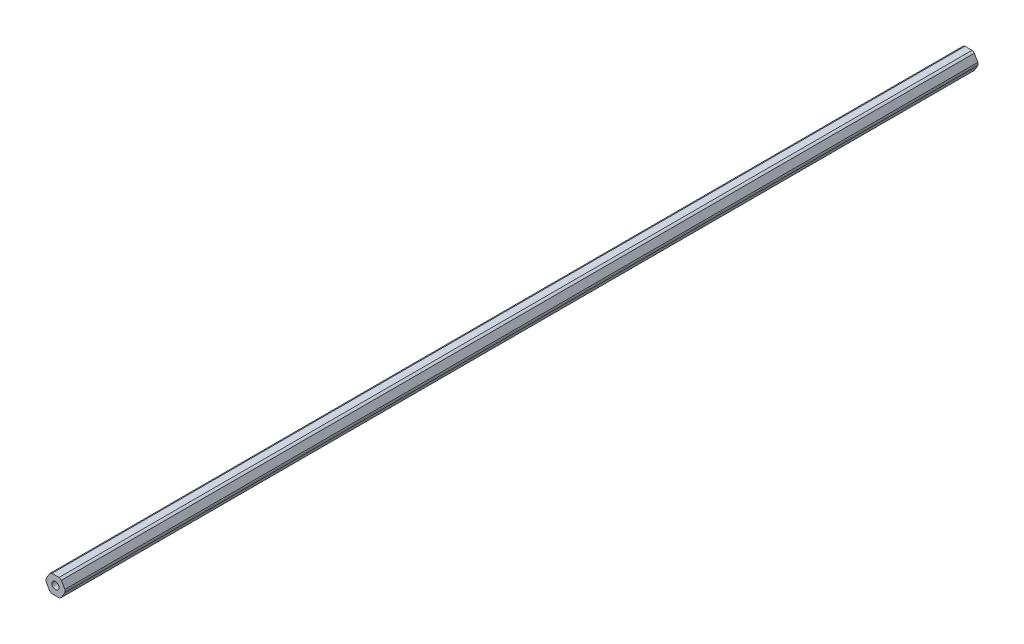
ISO-10303-21;
HEADER;
FILE_DESCRIPTION(('STEP AP214'),'2;1');
FILE_NAME('part.step','',(''),(''),'','','');
FILE_SCHEMA(('AUTOMOTIVE_DESIGN { 1 0 10303 214 1 1 1 1 }'));
ENDSEC;
DATA;
#1=APPLICATION_CONTEXT('core data for automotive mechanical design processes');
#2=APPLICATION_PROTOCOL_DEFINITION('international standard','automotive_design',2000,#1);
#3=PRODUCT_CONTEXT('',#1,'mechanical');
#4=PRODUCT('Part','Part','',(#3));
#5=PRODUCT_RELATED_PRODUCT_CATEGORY('part','',(#4));
#6=PRODUCT_DEFINITION_FORMATION('','',#4);
#7=PRODUCT_DEFINITION_CONTEXT('part definition',#1,'design');
#8=PRODUCT_DEFINITION('design','',#6,#7);
#9=PRODUCT_DEFINITION_SHAPE('','',#8);
#10=(LENGTH_UNIT() NAMED_UNIT(*) SI_UNIT(.MILLI.,.METRE.));
#11=(NAMED_UNIT(*) PLANE_ANGLE_UNIT() SI_UNIT($,.RADIAN.));
#12=(NAMED_UNIT(*) SI_UNIT($,.STERADIAN.) SOLID_ANGLE_UNIT());
#13=UNCERTAINTY_MEASURE_WITH_UNIT(LENGTH_MEASURE(1.E-05),#10,'distance_accuracy_value','');
#14=(GEOMETRIC_REPRESENTATION_CONTEXT(3) GLOBAL_UNCERTAINTY_ASSIGNED_CONTEXT((#13)) GLOBAL_UNIT_ASSIGNED_CONTEXT((#10,
#11,#12)) REPRESENTATION_CONTEXT('',''));
#15=CARTESIAN_POINT('',(0.,0.,0.));
#16=DIRECTION('',(0.,0.,1.));
#17=DIRECTION('',(1.,0.,0.));
#18=AXIS2_PLACEMENT_3D('',#15,#16,#17);
#19=CARTESIAN_POINT('',(0.,0.,-457.2));
#20=DIRECTION('',(0.,0.,1.));
#21=DIRECTION('',(1.,0.,0.));
#22=AXIS2_PLACEMENT_3D('',#19,#20,#21);
#23=CYLINDRICAL_SURFACE('',#22,2.55);
#24=CARTESIAN_POINT('',(0.,0.,-330.2));
#25=DIRECTION('',(0.,0.,-1.));
#26=DIRECTION('',(-1.,0.,0.));
#27=AXIS2_PLACEMENT_3D('',#24,#25,#26);
#28=CIRCLE('',#27,2.55);
#29=CARTESIAN_POINT('',(2.55,0.,-330.2));
#30=VERTEX_POINT('',#29);
#31=CARTESIAN_POINT('',(-2.55,0.,-330.2));
#32=VERTEX_POINT('',#31);
#33=EDGE_CURVE('E73',#30,#32,#28,.F.);
#34=ORIENTED_EDGE('',*,*,#33,.F.);
#35=DIRECTION('',(0.,0.,1.));
#36=VECTOR('',#35,1.);
#37=CARTESIAN_POINT('',(2.55,0.,-457.2));
#38=LINE('',#37,#36);
#39=CARTESIAN_POINT('',(2.55,0.,330.2));
#40=VERTEX_POINT('',#39);
#41=EDGE_CURVE('E212',#30,#40,#38,.T.);
#42=ORIENTED_EDGE('',*,*,#41,.T.);
#43=CARTESIAN_POINT('',(0.,0.,330.2));
#44=DIRECTION('',(0.,0.,-1.));
#45=DIRECTION('',(-1.,0.,0.));
#46=AXIS2_PLACEMENT_3D('',#43,#44,#45);
#47=CIRCLE('',#46,2.55);
#48=CARTESIAN_POINT('',(-2.55,0.,330.2));
#49=VERTEX_POINT('',#48);
#50=EDGE_CURVE('E219',#40,#49,#47,.F.);
#51=ORIENTED_EDGE('',*,*,#50,.T.);
#52=DIRECTION('',(0.,0.,1.));
#53=VECTOR('',#52,1.);
#54=CARTESIAN_POINT('',(-2.55,0.,-457.2));
#55=LINE('',#54,#53);
#56=EDGE_CURVE('E214',#32,#49,#55,.T.);
#57=ORIENTED_EDGE('',*,*,#56,.F.);
#58=EDGE_LOOP('',(#34,#42,#51,#57));
#59=FACE_BOUND('',#58,.T.);
#60=ADVANCED_FACE('F51',(#59),#23,.F.);
#61=CARTESIAN_POINT('',(0.,0.,-457.2));
#62=DIRECTION('',(0.,0.,1.));
#63=DIRECTION('',(1.,0.,0.));
#64=AXIS2_PLACEMENT_3D('',#61,#62,#63);
#65=CYLINDRICAL_SURFACE('',#64,6.87);
#66=DIRECTION('',(0.,0.,-1.));
#67=VECTOR('',#66,1.);
#68=CARTESIAN_POINT('',(4.24149521323254,5.40431479062105,-457.2));
#69=LINE('',#68,#67);
#70=CARTESIAN_POINT('',(4.24149521323254,5.40431479062105,330.2));
#71=VERTEX_POINT('',#70);
#72=CARTESIAN_POINT('',(4.24149521323254,5.40431479062105,-330.2));
#73=VERTEX_POINT('',#72);
#74=EDGE_CURVE('E202',#71,#73,#69,.T.);
#75=ORIENTED_EDGE('',*,*,#74,.T.);
#76=CARTESIAN_POINT('',(0.,0.,-330.2));
#77=DIRECTION('',(0.,0.,-1.));
#78=DIRECTION('',(-1.,0.,0.));
#79=AXIS2_PLACEMENT_3D('',#76,#77,#78);
#80=CIRCLE('',#79,6.87);
#81=CARTESIAN_POINT('',(2.55952629210952,6.3754,-330.2));
#82=VERTEX_POINT('',#81);
#83=EDGE_CURVE('E318',#73,#82,#80,.F.);
#84=ORIENTED_EDGE('',*,*,#83,.T.);
#85=DIRECTION('',(0.,0.,1.));
#86=VECTOR('',#85,1.);
#87=CARTESIAN_POINT('',(2.55952629210952,6.3754,-457.2));
#88=LINE('',#87,#86);
#89=CARTESIAN_POINT('',(2.55952629210952,6.3754,330.2));
#90=VERTEX_POINT('',#89);
#91=EDGE_CURVE('E200',#82,#90,#88,.T.);
#92=ORIENTED_EDGE('',*,*,#91,.T.);
#93=CARTESIAN_POINT('',(0.,0.,330.2));
#94=DIRECTION('',(0.,0.,-1.));
#95=DIRECTION('',(-1.,0.,0.));
#96=AXIS2_PLACEMENT_3D('',#93,#94,#95);
#97=CIRCLE('',#96,6.87);
#98=EDGE_CURVE('E249',#71,#90,#97,.F.);
#99=ORIENTED_EDGE('',*,*,#98,.F.);
#100=EDGE_LOOP('',(#75,#84,#92,#99));
#101=FACE_BOUND('',#100,.T.);
#102=ADVANCED_FACE('F344',(#101),#65,.T.);
#103=CARTESIAN_POINT('',(0.,0.,-457.2));
#104=DIRECTION('',(0.,0.,1.));
#105=DIRECTION('',(1.,0.,0.));
#106=AXIS2_PLACEMENT_3D('',#103,#104,#105);
#107=CYLINDRICAL_SURFACE('',#106,6.87);
#108=DIRECTION('',(0.,0.,-1.));
#109=VECTOR('',#108,1.);
#110=CARTESIAN_POINT('',(-2.55952629210953,6.3754,-457.2));
#111=LINE('',#110,#109);
#112=CARTESIAN_POINT('',(-2.55952629210953,6.3754,330.2));
#113=VERTEX_POINT('',#112);
#114=CARTESIAN_POINT('',(-2.55952629210953,6.3754,-330.2));
#115=VERTEX_POINT('',#114);
#116=EDGE_CURVE('E196',#113,#115,#111,.T.);
#117=ORIENTED_EDGE('',*,*,#116,.T.);
#118=CARTESIAN_POINT('',(0.,0.,-330.2));
#119=DIRECTION('',(0.,0.,-1.));
#120=DIRECTION('',(-1.,0.,0.));
#121=AXIS2_PLACEMENT_3D('',#118,#119,#120);
#122=CIRCLE('',#121,6.87);
#123=CARTESIAN_POINT('',(-4.24149521323254,5.40431479062105,-330.2));
#124=VERTEX_POINT('',#123);
#125=EDGE_CURVE('E307',#115,#124,#122,.F.);
#126=ORIENTED_EDGE('',*,*,#125,.T.);
#127=DIRECTION('',(0.,0.,1.));
#128=VECTOR('',#127,1.);
#129=CARTESIAN_POINT('',(-4.24149521323255,5.40431479062105,-457.2));
#130=LINE('',#129,#128);
#131=CARTESIAN_POINT('',(-4.24149521323254,5.40431479062105,330.2));
#132=VERTEX_POINT('',#131);
#133=EDGE_CURVE('E199',#124,#132,#130,.T.);
#134=ORIENTED_EDGE('',*,*,#133,.T.);
#135=CARTESIAN_POINT('',(0.,0.,330.2));
#136=DIRECTION('',(0.,0.,-1.));
#137=DIRECTION('',(-1.,0.,0.));
#138=AXIS2_PLACEMENT_3D('',#135,#136,#137);
#139=CIRCLE('',#138,6.87);
#140=EDGE_CURVE('E261',#113,#132,#139,.F.);
#141=ORIENTED_EDGE('',*,*,#140,.F.);
#142=EDGE_LOOP('',(#117,#126,#134,#141));
#143=FACE_BOUND('',#142,.T.);
#144=ADVANCED_FACE('F350',(#143),#107,.T.);
#145=CARTESIAN_POINT('',(0.,0.,-457.2));
#146=DIRECTION('',(0.,0.,1.));
#147=DIRECTION('',(1.,0.,0.));
#148=AXIS2_PLACEMENT_3D('',#145,#146,#147);
#149=CYLINDRICAL_SURFACE('',#148,6.87);
#150=CARTESIAN_POINT('',(0.,0.,-330.2));
#151=DIRECTION('',(0.,0.,-1.));
#152=DIRECTION('',(-1.,0.,0.));
#153=AXIS2_PLACEMENT_3D('',#150,#151,#152);
#154=CIRCLE('',#153,6.87);
#155=CARTESIAN_POINT('',(-6.80102150534207,0.971085209378959,-330.2));
#156=VERTEX_POINT('',#155);
#157=CARTESIAN_POINT('',(-6.80102150534208,-0.971085209378959,-330.2));
#158=VERTEX_POINT('',#157);
#159=EDGE_CURVE('E302',#156,#158,#154,.F.);
#160=ORIENTED_EDGE('',*,*,#159,.T.);
#161=DIRECTION('',(0.,0.,1.));
#162=VECTOR('',#161,1.);
#163=CARTESIAN_POINT('',(-6.80102150534208,-0.971085209378962,-457.2));
#164=LINE('',#163,#162);
#165=CARTESIAN_POINT('',(-6.80102150534208,-0.971085209378956,330.2));
#166=VERTEX_POINT('',#165);
#167=EDGE_CURVE('E191',#158,#166,#164,.T.);
#168=ORIENTED_EDGE('',*,*,#167,.T.);
#169=CARTESIAN_POINT('',(0.,0.,330.2));
#170=DIRECTION('',(0.,0.,-1.));
#171=DIRECTION('',(-1.,0.,0.));
#172=AXIS2_PLACEMENT_3D('',#169,#170,#171);
#173=CIRCLE('',#172,6.87);
#174=CARTESIAN_POINT('',(-6.80102150534207,0.971085209378959,330.2));
#175=VERTEX_POINT('',#174);
#176=EDGE_CURVE('E257',#175,#166,#173,.F.);
#177=ORIENTED_EDGE('',*,*,#176,.F.);
#178=DIRECTION('',(0.,0.,-1.));
#179=VECTOR('',#178,1.);
#180=CARTESIAN_POINT('',(-6.80102150534208,0.97108520937896,-457.2));
#181=LINE('',#180,#179);
#182=EDGE_CURVE('E274',#175,#156,#181,.T.);
#183=ORIENTED_EDGE('',*,*,#182,.T.);
#184=EDGE_LOOP('',(#160,#168,#177,#183));
#185=FACE_BOUND('',#184,.T.);
#186=ADVANCED_FACE('F300',(#185),#149,.T.);
#187=CARTESIAN_POINT('',(0.,0.,-457.2));
#188=DIRECTION('',(0.,0.,1.));
#189=DIRECTION('',(1.,0.,0.));
#190=AXIS2_PLACEMENT_3D('',#187,#188,#189);
#191=CYLINDRICAL_SURFACE('',#190,6.87);
#192=DIRECTION('',(0.,0.,-1.));
#193=VECTOR('',#192,1.);
#194=CARTESIAN_POINT('',(-4.24149521323255,-5.40431479062104,-457.2));
#195=LINE('',#194,#193);
#196=CARTESIAN_POINT('',(-4.24149521323254,-5.40431479062105,330.2));
#197=VERTEX_POINT('',#196);
#198=CARTESIAN_POINT('',(-4.24149521323254,-5.40431479062105,-330.2));
#199=VERTEX_POINT('',#198);
#200=EDGE_CURVE('E177',#197,#199,#195,.T.);
#201=ORIENTED_EDGE('',*,*,#200,.T.);
#202=CARTESIAN_POINT('',(0.,0.,-330.2));
#203=DIRECTION('',(0.,0.,-1.));
#204=DIRECTION('',(-1.,0.,0.));
#205=AXIS2_PLACEMENT_3D('',#202,#203,#204);
#206=CIRCLE('',#205,6.87);
#207=CARTESIAN_POINT('',(-2.55952629210953,-6.3754,-330.2));
#208=VERTEX_POINT('',#207);
#209=EDGE_CURVE('E160',#199,#208,#206,.F.);
#210=ORIENTED_EDGE('',*,*,#209,.T.);
#211=DIRECTION('',(0.,0.,1.));
#212=VECTOR('',#211,1.);
#213=CARTESIAN_POINT('',(-2.55952629210953,-6.3754,-457.2));
#214=LINE('',#213,#212);
#215=CARTESIAN_POINT('',(-2.55952629210953,-6.3754,330.2));
#216=VERTEX_POINT('',#215);
#217=EDGE_CURVE('E174',#208,#216,#214,.T.);
#218=ORIENTED_EDGE('',*,*,#217,.T.);
#219=CARTESIAN_POINT('',(0.,0.,330.2));
#220=DIRECTION('',(0.,0.,-1.));
#221=DIRECTION('',(-1.,0.,0.));
#222=AXIS2_PLACEMENT_3D('',#219,#220,#221);
#223=CIRCLE('',#222,6.87);
#224=EDGE_CURVE('E269',#197,#216,#223,.F.);
#225=ORIENTED_EDGE('',*,*,#224,.F.);
#226=EDGE_LOOP('',(#201,#210,#218,#225));
#227=FACE_BOUND('',#226,.T.);
#228=ADVANCED_FACE('F53',(#227),#191,.T.);
#229=CARTESIAN_POINT('',(0.,0.,-457.2));
#230=DIRECTION('',(0.,0.,1.));
#231=DIRECTION('',(1.,0.,0.));
#232=AXIS2_PLACEMENT_3D('',#229,#230,#231);
#233=CYLINDRICAL_SURFACE('',#232,6.87);
#234=DIRECTION('',(0.,0.,-1.));
#235=VECTOR('',#234,1.);
#236=CARTESIAN_POINT('',(2.55952629210953,-6.3754,-457.2));
#237=LINE('',#236,#235);
#238=CARTESIAN_POINT('',(2.55952629210953,-6.3754,330.2));
#239=VERTEX_POINT('',#238);
#240=CARTESIAN_POINT('',(2.55952629210953,-6.3754,-330.2));
#241=VERTEX_POINT('',#240);
#242=EDGE_CURVE('E185',#239,#241,#237,.T.);
#243=ORIENTED_EDGE('',*,*,#242,.T.);
#244=CARTESIAN_POINT('',(0.,0.,-330.2));
#245=DIRECTION('',(0.,0.,-1.));
#246=DIRECTION('',(-1.,0.,0.));
#247=AXIS2_PLACEMENT_3D('',#244,#245,#246);
#248=CIRCLE('',#247,6.87);
#249=CARTESIAN_POINT('',(4.24149521323254,-5.40431479062105,-330.2));
#250=VERTEX_POINT('',#249);
#251=EDGE_CURVE('E163',#241,#250,#248,.F.);
#252=ORIENTED_EDGE('',*,*,#251,.T.);
#253=DIRECTION('',(0.,0.,1.));
#254=VECTOR('',#253,1.);
#255=CARTESIAN_POINT('',(4.24149521323255,-5.40431479062104,-457.2));
#256=LINE('',#255,#254);
#257=CARTESIAN_POINT('',(4.24149521323254,-5.40431479062105,330.2));
#258=VERTEX_POINT('',#257);
#259=EDGE_CURVE('E286',#250,#258,#256,.T.);
#260=ORIENTED_EDGE('',*,*,#259,.T.);
#261=CARTESIAN_POINT('',(0.,0.,330.2));
#262=DIRECTION('',(0.,0.,-1.));
#263=DIRECTION('',(-1.,0.,0.));
#264=AXIS2_PLACEMENT_3D('',#261,#262,#263);
#265=CIRCLE('',#264,6.87);
#266=EDGE_CURVE('E241',#239,#258,#265,.F.);
#267=ORIENTED_EDGE('',*,*,#266,.F.);
#268=EDGE_LOOP('',(#243,#252,#260,#267));
#269=FACE_BOUND('',#268,.T.);
#270=ADVANCED_FACE('F380',(#269),#233,.T.);
#271=CARTESIAN_POINT('',(0.,0.,-457.2));
#272=DIRECTION('',(0.,0.,1.));
#273=DIRECTION('',(1.,0.,0.));
#274=AXIS2_PLACEMENT_3D('',#271,#272,#273);
#275=CYLINDRICAL_SURFACE('',#274,6.87);
#276=DIRECTION('',(0.,0.,1.));
#277=VECTOR('',#276,1.);
#278=CARTESIAN_POINT('',(6.87,0.,-457.2));
#279=LINE('',#278,#277);
#280=CARTESIAN_POINT('',(6.87,0.,-330.2));
#281=VERTEX_POINT('',#280);
#282=CARTESIAN_POINT('',(6.87,0.,330.2));
#283=VERTEX_POINT('',#282);
#284=EDGE_CURVE('E277',#281,#283,#279,.T.);
#285=ORIENTED_EDGE('',*,*,#284,.F.);
#286=CARTESIAN_POINT('',(0.,0.,-330.2));
#287=DIRECTION('',(0.,0.,-1.));
#288=DIRECTION('',(-1.,0.,0.));
#289=AXIS2_PLACEMENT_3D('',#286,#287,#288);
#290=CIRCLE('',#289,6.87);
#291=CARTESIAN_POINT('',(6.80102150534208,0.971085209378949,-330.2));
#292=VERTEX_POINT('',#291);
#293=EDGE_CURVE('E67',#281,#292,#290,.F.);
#294=ORIENTED_EDGE('',*,*,#293,.T.);
#295=DIRECTION('',(0.,0.,1.));
#296=VECTOR('',#295,1.);
#297=CARTESIAN_POINT('',(6.80102150534208,0.971085209378949,-457.2));
#298=LINE('',#297,#296);
#299=CARTESIAN_POINT('',(6.80102150534208,0.97108520937895,330.2));
#300=VERTEX_POINT('',#299);
#301=EDGE_CURVE('E205',#292,#300,#298,.T.);
#302=ORIENTED_EDGE('',*,*,#301,.T.);
#303=CARTESIAN_POINT('',(0.,0.,330.2));
#304=DIRECTION('',(0.,0.,-1.));
#305=DIRECTION('',(-1.,0.,0.));
#306=AXIS2_PLACEMENT_3D('',#303,#304,#305);
#307=CIRCLE('',#306,6.87);
#308=EDGE_CURVE('E237',#283,#300,#307,.F.);
#309=ORIENTED_EDGE('',*,*,#308,.F.);
#310=EDGE_LOOP('',(#285,#294,#302,#309));
#311=FACE_BOUND('',#310,.T.);
#312=ADVANCED_FACE('F383',(#311),#275,.T.);
#313=CARTESIAN_POINT('',(-3.68083890619154,-6.3754,457.2));
#314=DIRECTION('',(0.,1.,0.));
#315=DIRECTION('',(1.,0.,0.));
#316=AXIS2_PLACEMENT_3D('',#313,#314,#315);
#317=PLANE('',#316);
#318=DIRECTION('',(1.,0.,0.));
#319=VECTOR('',#318,1.);
#320=CARTESIAN_POINT('',(-6.87,-6.3754,-330.2));
#321=LINE('',#320,#319);
#322=EDGE_CURVE('E156',#208,#241,#321,.T.);
#323=ORIENTED_EDGE('',*,*,#322,.T.);
#324=ORIENTED_EDGE('',*,*,#242,.F.);
#325=DIRECTION('',(1.,0.,0.));
#326=VECTOR('',#325,1.);
#327=CARTESIAN_POINT('',(-6.87,-6.3754,330.2));
#328=LINE('',#327,#326);
#329=EDGE_CURVE('E179',#216,#239,#328,.T.);
#330=ORIENTED_EDGE('',*,*,#329,.F.);
#331=ORIENTED_EDGE('',*,*,#217,.F.);
#332=EDGE_LOOP('',(#323,#324,#330,#331));
#333=FACE_BOUND('',#332,.T.);
#334=ADVANCED_FACE('F183',(#333),#317,.F.);
#335=CARTESIAN_POINT('',(-7.36167781238308,0.,457.2));
#336=DIRECTION('',(0.866025403784439,0.5,0.));
#337=DIRECTION('',(0.,0.,-1.));
#338=AXIS2_PLACEMENT_3D('',#335,#336,#337);
#339=PLANE('',#338);
#340=DIRECTION('',(-0.5,0.866025403784439,0.));
#341=VECTOR('',#340,1.);
#342=CARTESIAN_POINT('',(-7.36167781238308,0.,-330.2));
#343=LINE('',#342,#341);
#344=EDGE_CURVE('E180',#199,#158,#343,.T.);
#345=ORIENTED_EDGE('',*,*,#344,.F.);
#346=ORIENTED_EDGE('',*,*,#200,.F.);
#347=DIRECTION('',(-0.5,0.866025403784439,0.));
#348=VECTOR('',#347,1.);
#349=CARTESIAN_POINT('',(-7.36167781238308,0.,330.2));
#350=LINE('',#349,#348);
#351=EDGE_CURVE('E265',#197,#166,#350,.T.);
#352=ORIENTED_EDGE('',*,*,#351,.T.);
#353=ORIENTED_EDGE('',*,*,#167,.F.);
#354=EDGE_LOOP('',(#345,#346,#352,#353));
#355=FACE_BOUND('',#354,.T.);
#356=ADVANCED_FACE('F305',(#355),#339,.F.);
#357=CARTESIAN_POINT('',(-3.68083890619154,6.3754,457.2));
#358=DIRECTION('',(0.866025403784439,-0.5,0.));
#359=DIRECTION('',(0.,0.,-1.));
#360=AXIS2_PLACEMENT_3D('',#357,#358,#359);
#361=PLANE('',#360);
#362=DIRECTION('',(0.5,0.866025403784439,0.));
#363=VECTOR('',#362,1.);
#364=CARTESIAN_POINT('',(-3.68083890619154,6.3754,-330.2));
#365=LINE('',#364,#363);
#366=EDGE_CURVE('E315',#156,#124,#365,.T.);
#367=ORIENTED_EDGE('',*,*,#366,.F.);
#368=ORIENTED_EDGE('',*,*,#182,.F.);
#369=DIRECTION('',(0.5,0.866025403784439,0.));
#370=VECTOR('',#369,1.);
#371=CARTESIAN_POINT('',(-3.68083890619154,6.3754,330.2));
#372=LINE('',#371,#370);
#373=EDGE_CURVE('E253',#175,#132,#372,.T.);
#374=ORIENTED_EDGE('',*,*,#373,.T.);
#375=ORIENTED_EDGE('',*,*,#133,.F.);
#376=EDGE_LOOP('',(#367,#368,#374,#375));
#377=FACE_BOUND('',#376,.T.);
#378=ADVANCED_FACE('F354',(#377),#361,.F.);
#379=CARTESIAN_POINT('',(3.68083890619154,6.3754,457.2));
#380=DIRECTION('',(0.,-1.,0.));
#381=DIRECTION('',(0.,0.,-1.));
#382=AXIS2_PLACEMENT_3D('',#379,#380,#381);
#383=PLANE('',#382);
#384=DIRECTION('',(1.,0.,0.));
#385=VECTOR('',#384,1.);
#386=CARTESIAN_POINT('',(-6.87,6.3754,-330.2));
#387=LINE('',#386,#385);
#388=EDGE_CURVE('E169',#115,#82,#387,.T.);
#389=ORIENTED_EDGE('',*,*,#388,.F.);
#390=ORIENTED_EDGE('',*,*,#116,.F.);
#391=DIRECTION('',(1.,0.,0.));
#392=VECTOR('',#391,1.);
#393=CARTESIAN_POINT('',(-6.87,6.3754,330.2));
#394=LINE('',#393,#392);
#395=EDGE_CURVE('E223',#113,#90,#394,.T.);
#396=ORIENTED_EDGE('',*,*,#395,.T.);
#397=ORIENTED_EDGE('',*,*,#91,.F.);
#398=EDGE_LOOP('',(#389,#390,#396,#397));
#399=FACE_BOUND('',#398,.T.);
#400=ADVANCED_FACE('F347',(#399),#383,.F.);
#401=CARTESIAN_POINT('',(7.36167781238308,0.,457.2));
#402=DIRECTION('',(-0.866025403784439,-0.5,0.));
#403=DIRECTION('',(-0.5,0.866025403784439,0.));
#404=AXIS2_PLACEMENT_3D('',#401,#402,#403);
#405=PLANE('',#404);
#406=DIRECTION('',(0.5,-0.866025403784439,0.));
#407=VECTOR('',#406,1.);
#408=CARTESIAN_POINT('',(7.36167781238308,0.,-330.2));
#409=LINE('',#408,#407);
#410=EDGE_CURVE('E322',#73,#292,#409,.T.);
#411=ORIENTED_EDGE('',*,*,#410,.F.);
#412=ORIENTED_EDGE('',*,*,#74,.F.);
#413=DIRECTION('',(0.5,-0.866025403784439,0.));
#414=VECTOR('',#413,1.);
#415=CARTESIAN_POINT('',(7.36167781238308,0.,330.2));
#416=LINE('',#415,#414);
#417=EDGE_CURVE('E245',#71,#300,#416,.T.);
#418=ORIENTED_EDGE('',*,*,#417,.T.);
#419=ORIENTED_EDGE('',*,*,#301,.F.);
#420=EDGE_LOOP('',(#411,#412,#418,#419));
#421=FACE_BOUND('',#420,.T.);
#422=ADVANCED_FACE('F361',(#421),#405,.F.);
#423=CARTESIAN_POINT('',(3.68083890619154,-6.3754,457.2));
#424=DIRECTION('',(-0.866025403784439,0.5,0.));
#425=DIRECTION('',(0.,0.,1.));
#426=AXIS2_PLACEMENT_3D('',#423,#424,#425);
#427=PLANE('',#426);
#428=DIRECTION('',(-0.5,-0.866025403784439,0.));
#429=VECTOR('',#428,1.);
#430=CARTESIAN_POINT('',(3.68083890619154,-6.3754,-330.2));
#431=LINE('',#430,#429);
#432=CARTESIAN_POINT('',(6.80102150534208,-0.971085209378958,-330.2));
#433=VERTEX_POINT('',#432);
#434=EDGE_CURVE('E329',#433,#250,#431,.T.);
#435=ORIENTED_EDGE('',*,*,#434,.F.);
#436=DIRECTION('',(0.,0.,-1.));
#437=VECTOR('',#436,1.);
#438=CARTESIAN_POINT('',(6.80102150534208,-0.971085209378962,-457.2));
#439=LINE('',#438,#437);
#440=CARTESIAN_POINT('',(6.80102150534208,-0.971085209378962,330.2));
#441=VERTEX_POINT('',#440);
#442=EDGE_CURVE('E281',#441,#433,#439,.T.);
#443=ORIENTED_EDGE('',*,*,#442,.F.);
#444=DIRECTION('',(-0.5,-0.866025403784439,0.));
#445=VECTOR('',#444,1.);
#446=CARTESIAN_POINT('',(3.68083890619154,-6.3754,330.2));
#447=LINE('',#446,#445);
#448=EDGE_CURVE('E228',#441,#258,#447,.T.);
#449=ORIENTED_EDGE('',*,*,#448,.T.);
#450=ORIENTED_EDGE('',*,*,#259,.F.);
#451=EDGE_LOOP('',(#435,#443,#449,#450));
#452=FACE_BOUND('',#451,.T.);
#453=ADVANCED_FACE('F374',(#452),#427,.F.);
#454=CARTESIAN_POINT('',(0.,0.,-457.2));
#455=DIRECTION('',(0.,0.,1.));
#456=DIRECTION('',(1.,0.,0.));
#457=AXIS2_PLACEMENT_3D('',#454,#455,#456);
#458=CYLINDRICAL_SURFACE('',#457,6.87);
#459=ORIENTED_EDGE('',*,*,#442,.T.);
#460=CARTESIAN_POINT('',(0.,0.,-330.2));
#461=DIRECTION('',(0.,0.,-1.));
#462=DIRECTION('',(-1.,0.,0.));
#463=AXIS2_PLACEMENT_3D('',#460,#461,#462);
#464=CIRCLE('',#463,6.87);
#465=EDGE_CURVE('E332',#433,#281,#464,.F.);
#466=ORIENTED_EDGE('',*,*,#465,.T.);
#467=ORIENTED_EDGE('',*,*,#284,.T.);
#468=CARTESIAN_POINT('',(0.,0.,330.2));
#469=DIRECTION('',(0.,0.,-1.));
#470=DIRECTION('',(-1.,0.,0.));
#471=AXIS2_PLACEMENT_3D('',#468,#469,#470);
#472=CIRCLE('',#471,6.87);
#473=EDGE_CURVE('E222',#441,#283,#472,.F.);
#474=ORIENTED_EDGE('',*,*,#473,.F.);
#475=EDGE_LOOP('',(#459,#466,#467,#474));
#476=FACE_BOUND('',#475,.T.);
#477=ADVANCED_FACE('F371',(#476),#458,.T.);
#478=CARTESIAN_POINT('',(0.,0.,-457.2));
#479=DIRECTION('',(0.,0.,1.));
#480=DIRECTION('',(1.,0.,0.));
#481=AXIS2_PLACEMENT_3D('',#478,#479,#480);
#482=CYLINDRICAL_SURFACE('',#481,2.55);
#483=CARTESIAN_POINT('',(0.,0.,-330.2));
#484=DIRECTION('',(0.,0.,-1.));
#485=DIRECTION('',(-1.,0.,0.));
#486=AXIS2_PLACEMENT_3D('',#483,#484,#485);
#487=CIRCLE('',#486,2.55);
#488=EDGE_CURVE('E11',#32,#30,#487,.F.);
#489=ORIENTED_EDGE('',*,*,#488,.F.);
#490=ORIENTED_EDGE('',*,*,#56,.T.);
#491=CARTESIAN_POINT('',(0.,0.,330.2));
#492=DIRECTION('',(0.,0.,-1.));
#493=DIRECTION('',(-1.,0.,0.));
#494=AXIS2_PLACEMENT_3D('',#491,#492,#493);
#495=CIRCLE('',#494,2.55);
#496=EDGE_CURVE('E60',#49,#40,#495,.F.);
#497=ORIENTED_EDGE('',*,*,#496,.T.);
#498=ORIENTED_EDGE('',*,*,#41,.F.);
#499=EDGE_LOOP('',(#489,#490,#497,#498));
#500=FACE_BOUND('',#499,.T.);
#501=ADVANCED_FACE('F211',(#500),#482,.F.);
#502=CARTESIAN_POINT('',(-6.87,6.3754,330.2));
#503=DIRECTION('',(0.,0.,-1.));
#504=DIRECTION('',(-1.,0.,0.));
#505=AXIS2_PLACEMENT_3D('',#502,#503,#504);
#506=PLANE('',#505);
#507=ORIENTED_EDGE('',*,*,#224,.T.);
#508=ORIENTED_EDGE('',*,*,#329,.T.);
#509=ORIENTED_EDGE('',*,*,#266,.T.);
#510=ORIENTED_EDGE('',*,*,#448,.F.);
#511=ORIENTED_EDGE('',*,*,#473,.T.);
#512=ORIENTED_EDGE('',*,*,#308,.T.);
#513=ORIENTED_EDGE('',*,*,#417,.F.);
#514=ORIENTED_EDGE('',*,*,#98,.T.);
#515=ORIENTED_EDGE('',*,*,#395,.F.);
#516=ORIENTED_EDGE('',*,*,#140,.T.);
#517=ORIENTED_EDGE('',*,*,#373,.F.);
#518=ORIENTED_EDGE('',*,*,#176,.T.);
#519=ORIENTED_EDGE('',*,*,#351,.F.);
#520=EDGE_LOOP('',(#507,#508,#509,#510,#511,#512,#513,#514,#515,#516,#517,#518,#519));
#521=FACE_BOUND('',#520,.T.);
#522=ORIENTED_EDGE('',*,*,#496,.F.);
#523=ORIENTED_EDGE('',*,*,#50,.F.);
#524=EDGE_LOOP('',(#522,#523));
#525=FACE_BOUND('',#524,.T.);
#526=ADVANCED_FACE('F218',(#521,#525),#506,.F.);
#527=CARTESIAN_POINT('',(-6.87,6.3754,-330.2));
#528=DIRECTION('',(0.,0.,-1.));
#529=DIRECTION('',(-1.,0.,0.));
#530=AXIS2_PLACEMENT_3D('',#527,#528,#529);
#531=PLANE('',#530);
#532=ORIENTED_EDGE('',*,*,#344,.T.);
#533=ORIENTED_EDGE('',*,*,#159,.F.);
#534=ORIENTED_EDGE('',*,*,#366,.T.);
#535=ORIENTED_EDGE('',*,*,#125,.F.);
#536=ORIENTED_EDGE('',*,*,#388,.T.);
#537=ORIENTED_EDGE('',*,*,#83,.F.);
#538=ORIENTED_EDGE('',*,*,#410,.T.);
#539=ORIENTED_EDGE('',*,*,#293,.F.);
#540=ORIENTED_EDGE('',*,*,#465,.F.);
#541=ORIENTED_EDGE('',*,*,#434,.T.);
#542=ORIENTED_EDGE('',*,*,#251,.F.);
#543=ORIENTED_EDGE('',*,*,#322,.F.);
#544=ORIENTED_EDGE('',*,*,#209,.F.);
#545=EDGE_LOOP('',(#532,#533,#534,#535,#536,#537,#538,#539,#540,#541,#542,#543,#544));
#546=FACE_BOUND('',#545,.T.);
#547=ORIENTED_EDGE('',*,*,#33,.T.);
#548=ORIENTED_EDGE('',*,*,#488,.T.);
#549=EDGE_LOOP('',(#547,#548));
#550=FACE_BOUND('',#549,.T.);
#551=ADVANCED_FACE('F159',(#546,#550),#531,.T.);
#552=CLOSED_SHELL('',(#60,#102,#144,#186,#228,#270,#312,#334,#356,#378,#400,#422,#453,#477,#501,
#526,#551));
#553=MANIFOLD_SOLID_BREP('B2',#552);
#554=ADVANCED_BREP_SHAPE_REPRESENTATION('',(#18,#553),#14);
#555=SHAPE_DEFINITION_REPRESENTATION(#9,#554);
ENDSEC;
END-ISO-10303-21;
